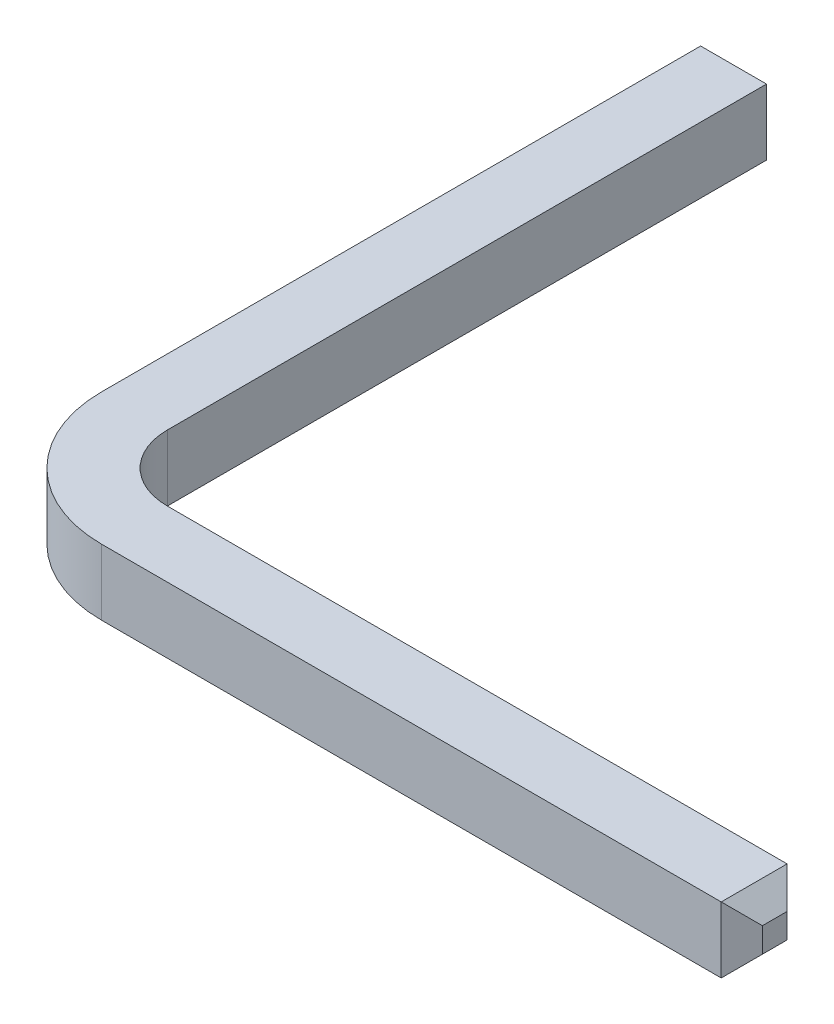
ISO-10303-21;
HEADER;
FILE_DESCRIPTION(('STEP AP214'),'2;1');
FILE_NAME('part.step','',(''),(''),'','','');
FILE_SCHEMA(('AUTOMOTIVE_DESIGN { 1 0 10303 214 1 1 1 1 }'));
ENDSEC;
DATA;
#1=APPLICATION_CONTEXT('core data for automotive mechanical design processes');
#2=APPLICATION_PROTOCOL_DEFINITION('international standard','automotive_design',2000,#1);
#3=PRODUCT_CONTEXT('',#1,'mechanical');
#4=PRODUCT('Part','Part','',(#3));
#5=PRODUCT_RELATED_PRODUCT_CATEGORY('part','',(#4));
#6=PRODUCT_DEFINITION_FORMATION('','',#4);
#7=PRODUCT_DEFINITION_CONTEXT('part definition',#1,'design');
#8=PRODUCT_DEFINITION('design','',#6,#7);
#9=PRODUCT_DEFINITION_SHAPE('','',#8);
#10=(LENGTH_UNIT() NAMED_UNIT(*) SI_UNIT(.MILLI.,.METRE.));
#11=(NAMED_UNIT(*) PLANE_ANGLE_UNIT() SI_UNIT($,.RADIAN.));
#12=(NAMED_UNIT(*) SI_UNIT($,.STERADIAN.) SOLID_ANGLE_UNIT());
#13=UNCERTAINTY_MEASURE_WITH_UNIT(LENGTH_MEASURE(1.E-05),#10,'distance_accuracy_value','');
#14=(GEOMETRIC_REPRESENTATION_CONTEXT(3) GLOBAL_UNCERTAINTY_ASSIGNED_CONTEXT((#13)) GLOBAL_UNIT_ASSIGNED_CONTEXT((#10,
#11,#12)) REPRESENTATION_CONTEXT('',''));
#15=CARTESIAN_POINT('',(0.,0.,0.));
#16=DIRECTION('',(0.,0.,1.));
#17=DIRECTION('',(1.,0.,0.));
#18=AXIS2_PLACEMENT_3D('',#15,#16,#17);
#19=CARTESIAN_POINT('',(7.08,-0.22,7.1));
#20=DIRECTION('',(-0.707106781186548,0.707106781186548,0.));
#21=DIRECTION('',(-0.707106781186548,-0.707106781186548,0.));
#22=AXIS2_PLACEMENT_3D('',#19,#20,#21);
#23=PLANE('',#22);
#24=DIRECTION('',(-0.577350269189625,-0.577350269189627,-0.577350269189625));
#25=VECTOR('',#24,1.);
#26=CARTESIAN_POINT('',(7.18,-0.12,6.86));
#27=LINE('',#26,#25);
#28=CARTESIAN_POINT('',(7.18,-0.12,6.86));
#29=VERTEX_POINT('',#28);
#30=CARTESIAN_POINT('',(6.98,-0.32,6.66));
#31=VERTEX_POINT('',#30);
#32=EDGE_CURVE('E203',#29,#31,#27,.T.);
#33=ORIENTED_EDGE('',*,*,#32,.F.);
#34=DIRECTION('',(0.,0.,-1.));
#35=VECTOR('',#34,1.);
#36=CARTESIAN_POINT('',(7.18,-0.12,7.3));
#37=LINE('',#36,#35);
#38=CARTESIAN_POINT('',(7.18,-0.12,7.1));
#39=VERTEX_POINT('',#38);
#40=EDGE_CURVE('E215',#39,#29,#37,.T.);
#41=ORIENTED_EDGE('',*,*,#40,.F.);
#42=DIRECTION('',(0.577350269189625,0.577350269189627,-0.577350269189625));
#43=VECTOR('',#42,1.);
#44=CARTESIAN_POINT('',(6.98,-0.32,7.3));
#45=LINE('',#44,#43);
#46=CARTESIAN_POINT('',(6.98,-0.32,7.3));
#47=VERTEX_POINT('',#46);
#48=EDGE_CURVE('E229',#47,#39,#45,.T.);
#49=ORIENTED_EDGE('',*,*,#48,.F.);
#50=DIRECTION('',(0.,0.,1.));
#51=VECTOR('',#50,1.);
#52=CARTESIAN_POINT('',(6.98,-0.32,5.1935));
#53=LINE('',#52,#51);
#54=EDGE_CURVE('E128',#47,#31,#53,.F.);
#55=ORIENTED_EDGE('',*,*,#54,.T.);
#56=EDGE_LOOP('',(#33,#41,#49,#55));
#57=FACE_BOUND('',#56,.T.);
#58=ADVANCED_FACE('F16',(#57),#23,.F.);
#59=CARTESIAN_POINT('',(0.12,-0.22,0.1));
#60=DIRECTION('',(0.,0.707106781186548,0.707106781186548));
#61=DIRECTION('',(0.,-0.707106781186548,0.707106781186548));
#62=AXIS2_PLACEMENT_3D('',#59,#60,#61);
#63=PLANE('',#62);
#64=DIRECTION('',(-0.577350269189626,-0.577350269189626,0.577350269189626));
#65=VECTOR('',#64,1.);
#66=CARTESIAN_POINT('',(-0.12,-0.12,0.));
#67=LINE('',#66,#65);
#68=CARTESIAN_POINT('',(-0.12,-0.12,0.));
#69=VERTEX_POINT('',#68);
#70=CARTESIAN_POINT('',(-0.32,-0.32,0.2));
#71=VERTEX_POINT('',#70);
#72=EDGE_CURVE('E164',#69,#71,#67,.T.);
#73=ORIENTED_EDGE('',*,*,#72,.F.);
#74=DIRECTION('',(1.,0.,0.));
#75=VECTOR('',#74,1.);
#76=CARTESIAN_POINT('',(0.32,-0.12,0.));
#77=LINE('',#76,#75);
#78=CARTESIAN_POINT('',(0.12,-0.12,0.));
#79=VERTEX_POINT('',#78);
#80=EDGE_CURVE('E174',#79,#69,#77,.F.);
#81=ORIENTED_EDGE('',*,*,#80,.F.);
#82=DIRECTION('',(-0.577350269189626,0.577350269189626,-0.577350269189626));
#83=VECTOR('',#82,1.);
#84=CARTESIAN_POINT('',(0.32,-0.32,0.2));
#85=LINE('',#84,#83);
#86=CARTESIAN_POINT('',(0.32,-0.32,0.2));
#87=VERTEX_POINT('',#86);
#88=EDGE_CURVE('E175',#87,#79,#85,.T.);
#89=ORIENTED_EDGE('',*,*,#88,.F.);
#90=DIRECTION('',(1.,0.,0.));
#91=VECTOR('',#90,1.);
#92=CARTESIAN_POINT('',(1.8865,-0.320000000000001,0.2));
#93=LINE('',#92,#91);
#94=EDGE_CURVE('E179',#87,#71,#93,.F.);
#95=ORIENTED_EDGE('',*,*,#94,.T.);
#96=EDGE_LOOP('',(#73,#81,#89,#95));
#97=FACE_BOUND('',#96,.T.);
#98=ADVANCED_FACE('F343',(#97),#63,.F.);
#99=CARTESIAN_POINT('',(7.08,0.32,7.2));
#100=DIRECTION('',(0.707106781186548,0.,0.707106781186548));
#101=DIRECTION('',(0.707106781186548,0.,-0.707106781186548));
#102=AXIS2_PLACEMENT_3D('',#99,#100,#101);
#103=PLANE('',#102);
#104=DIRECTION('',(0.,-1.,0.));
#105=VECTOR('',#104,1.);
#106=CARTESIAN_POINT('',(6.98,0.32,7.3));
#107=LINE('',#106,#105);
#108=CARTESIAN_POINT('',(6.98,0.32,7.3));
#109=VERTEX_POINT('',#108);
#110=EDGE_CURVE('E133',#47,#109,#107,.F.);
#111=ORIENTED_EDGE('',*,*,#110,.F.);
#112=ORIENTED_EDGE('',*,*,#48,.T.);
#113=DIRECTION('',(0.,1.,0.));
#114=VECTOR('',#113,1.);
#115=CARTESIAN_POINT('',(7.18,0.32,7.1));
#116=LINE('',#115,#114);
#117=CARTESIAN_POINT('',(7.18,0.12,7.1));
#118=VERTEX_POINT('',#117);
#119=EDGE_CURVE('E225',#118,#39,#116,.F.);
#120=ORIENTED_EDGE('',*,*,#119,.F.);
#121=DIRECTION('',(0.577350269189624,-0.577350269189625,-0.577350269189629));
#122=VECTOR('',#121,1.);
#123=CARTESIAN_POINT('',(6.98,0.32,7.3));
#124=LINE('',#123,#122);
#125=EDGE_CURVE('E146',#109,#118,#124,.T.);
#126=ORIENTED_EDGE('',*,*,#125,.F.);
#127=EDGE_LOOP('',(#111,#112,#120,#126));
#128=FACE_BOUND('',#127,.T.);
#129=ADVANCED_FACE('F294',(#128),#103,.T.);
#130=CARTESIAN_POINT('',(7.18,0.32,7.3));
#131=DIRECTION('',(1.,0.,0.));
#132=DIRECTION('',(0.,0.,-1.));
#133=AXIS2_PLACEMENT_3D('',#130,#131,#132);
#134=PLANE('',#133);
#135=ORIENTED_EDGE('',*,*,#119,.T.);
#136=ORIENTED_EDGE('',*,*,#40,.T.);
#137=DIRECTION('',(0.,1.,0.));
#138=VECTOR('',#137,1.);
#139=CARTESIAN_POINT('',(7.18,0.32,6.86));
#140=LINE('',#139,#138);
#141=CARTESIAN_POINT('',(7.18,0.12,6.86));
#142=VERTEX_POINT('',#141);
#143=EDGE_CURVE('E209',#142,#29,#140,.F.);
#144=ORIENTED_EDGE('',*,*,#143,.F.);
#145=DIRECTION('',(0.,0.,1.));
#146=VECTOR('',#145,1.);
#147=CARTESIAN_POINT('',(7.18,0.12,7.1));
#148=LINE('',#147,#146);
#149=EDGE_CURVE('E218',#118,#142,#148,.F.);
#150=ORIENTED_EDGE('',*,*,#149,.F.);
#151=EDGE_LOOP('',(#135,#136,#144,#150));
#152=FACE_BOUND('',#151,.T.);
#153=ADVANCED_FACE('F297',(#152),#134,.T.);
#154=CARTESIAN_POINT('',(7.08,0.32,6.76));
#155=DIRECTION('',(0.707106781186548,0.,-0.707106781186548));
#156=DIRECTION('',(-0.707106781186548,0.,-0.707106781186548));
#157=AXIS2_PLACEMENT_3D('',#154,#155,#156);
#158=PLANE('',#157);
#159=DIRECTION('',(0.,1.,0.));
#160=VECTOR('',#159,1.);
#161=CARTESIAN_POINT('',(6.98,0.32,6.66));
#162=LINE('',#161,#160);
#163=CARTESIAN_POINT('',(6.98,0.32,6.66));
#164=VERTEX_POINT('',#163);
#165=EDGE_CURVE('E198',#164,#31,#162,.F.);
#166=ORIENTED_EDGE('',*,*,#165,.F.);
#167=DIRECTION('',(-0.577350269189624,0.577350269189625,-0.577350269189629));
#168=VECTOR('',#167,1.);
#169=CARTESIAN_POINT('',(7.18,0.12,6.86));
#170=LINE('',#169,#168);
#171=EDGE_CURVE('E222',#142,#164,#170,.T.);
#172=ORIENTED_EDGE('',*,*,#171,.F.);
#173=ORIENTED_EDGE('',*,*,#143,.T.);
#174=ORIENTED_EDGE('',*,*,#32,.T.);
#175=EDGE_LOOP('',(#166,#172,#173,#174));
#176=FACE_BOUND('',#175,.T.);
#177=ADVANCED_FACE('F301',(#176),#158,.T.);
#178=CARTESIAN_POINT('',(1.8865,-0.32,5.1935));
#179=DIRECTION('',(0.,1.,0.));
#180=DIRECTION('',(0.,0.,1.));
#181=AXIS2_PLACEMENT_3D('',#178,#179,#180);
#182=PLANE('',#181);
#183=DIRECTION('',(0.,0.,-1.));
#184=VECTOR('',#183,1.);
#185=CARTESIAN_POINT('',(0.32,-0.32,6.66));
#186=LINE('',#185,#184);
#187=CARTESIAN_POINT('',(0.32,-0.32,6.02));
#188=VERTEX_POINT('',#187);
#189=EDGE_CURVE('E182',#188,#87,#186,.T.);
#190=ORIENTED_EDGE('',*,*,#189,.F.);
#191=CARTESIAN_POINT('',(0.96,-0.32,6.02));
#192=DIRECTION('',(0.,-1.,0.));
#193=DIRECTION('',(0.,0.,-1.));
#194=AXIS2_PLACEMENT_3D('',#191,#192,#193);
#195=CIRCLE('',#194,0.64);
#196=CARTESIAN_POINT('',(0.96,-0.32,6.66));
#197=VERTEX_POINT('',#196);
#198=EDGE_CURVE('E197',#188,#197,#195,.F.);
#199=ORIENTED_EDGE('',*,*,#198,.T.);
#200=DIRECTION('',(1.,0.,0.));
#201=VECTOR('',#200,1.);
#202=CARTESIAN_POINT('',(7.18,-0.32,6.66));
#203=LINE('',#202,#201);
#204=EDGE_CURVE('E193',#31,#197,#203,.F.);
#205=ORIENTED_EDGE('',*,*,#204,.F.);
#206=ORIENTED_EDGE('',*,*,#54,.F.);
#207=DIRECTION('',(1.,0.,0.));
#208=VECTOR('',#207,1.);
#209=CARTESIAN_POINT('',(-0.32,-0.32,7.3));
#210=LINE('',#209,#208);
#211=CARTESIAN_POINT('',(0.96,-0.32,7.3));
#212=VERTEX_POINT('',#211);
#213=EDGE_CURVE('E124',#212,#47,#210,.T.);
#214=ORIENTED_EDGE('',*,*,#213,.F.);
#215=CARTESIAN_POINT('',(0.96,-0.32,6.02));
#216=DIRECTION('',(0.,-1.,0.));
#217=DIRECTION('',(0.,0.,-1.));
#218=AXIS2_PLACEMENT_3D('',#215,#216,#217);
#219=CIRCLE('',#218,1.28);
#220=CARTESIAN_POINT('',(-0.32,-0.32,6.02));
#221=VERTEX_POINT('',#220);
#222=EDGE_CURVE('E19',#221,#212,#219,.F.);
#223=ORIENTED_EDGE('',*,*,#222,.F.);
#224=DIRECTION('',(0.,0.,1.));
#225=VECTOR('',#224,1.);
#226=CARTESIAN_POINT('',(-0.32,-0.32,0.));
#227=LINE('',#226,#225);
#228=EDGE_CURVE('E109',#71,#221,#227,.T.);
#229=ORIENTED_EDGE('',*,*,#228,.F.);
#230=ORIENTED_EDGE('',*,*,#94,.F.);
#231=EDGE_LOOP('',(#190,#199,#205,#206,#214,#223,#229,#230));
#232=FACE_BOUND('',#231,.T.);
#233=ADVANCED_FACE('F126',(#232),#182,.F.);
#234=CARTESIAN_POINT('',(0.22,0.32,0.1));
#235=DIRECTION('',(0.707106781186548,0.,-0.707106781186548));
#236=DIRECTION('',(-0.707106781186548,0.,-0.707106781186548));
#237=AXIS2_PLACEMENT_3D('',#234,#235,#236);
#238=PLANE('',#237);
#239=ORIENTED_EDGE('',*,*,#88,.T.);
#240=DIRECTION('',(0.,1.,0.));
#241=VECTOR('',#240,1.);
#242=CARTESIAN_POINT('',(0.12,0.32,0.));
#243=LINE('',#242,#241);
#244=CARTESIAN_POINT('',(0.12,0.12,0.));
#245=VERTEX_POINT('',#244);
#246=EDGE_CURVE('E171',#245,#79,#243,.F.);
#247=ORIENTED_EDGE('',*,*,#246,.F.);
#248=DIRECTION('',(-0.577350269189626,-0.577350269189626,-0.577350269189626));
#249=VECTOR('',#248,1.);
#250=CARTESIAN_POINT('',(0.32,0.32,0.2));
#251=LINE('',#250,#249);
#252=CARTESIAN_POINT('',(0.32,0.319999999999999,0.2));
#253=VERTEX_POINT('',#252);
#254=EDGE_CURVE('E34',#253,#245,#251,.T.);
#255=ORIENTED_EDGE('',*,*,#254,.F.);
#256=DIRECTION('',(0.,1.,0.));
#257=VECTOR('',#256,1.);
#258=CARTESIAN_POINT('',(0.32,0.32,0.2));
#259=LINE('',#258,#257);
#260=EDGE_CURVE('E186',#87,#253,#259,.T.);
#261=ORIENTED_EDGE('',*,*,#260,.F.);
#262=EDGE_LOOP('',(#239,#247,#255,#261));
#263=FACE_BOUND('',#262,.T.);
#264=ADVANCED_FACE('F339',(#263),#238,.T.);
#265=CARTESIAN_POINT('',(0.32,0.32,0.));
#266=DIRECTION('',(0.,0.,-1.));
#267=DIRECTION('',(0.,1.,0.));
#268=AXIS2_PLACEMENT_3D('',#265,#266,#267);
#269=PLANE('',#268);
#270=DIRECTION('',(0.,1.,0.));
#271=VECTOR('',#270,1.);
#272=CARTESIAN_POINT('',(-0.12,0.32,0.));
#273=LINE('',#272,#271);
#274=CARTESIAN_POINT('',(-0.12,0.12,0.));
#275=VERTEX_POINT('',#274);
#276=EDGE_CURVE('E152',#275,#69,#273,.F.);
#277=ORIENTED_EDGE('',*,*,#276,.F.);
#278=DIRECTION('',(1.,0.,0.));
#279=VECTOR('',#278,1.);
#280=CARTESIAN_POINT('',(0.12,0.12,0.));
#281=LINE('',#280,#279);
#282=EDGE_CURVE('E159',#245,#275,#281,.F.);
#283=ORIENTED_EDGE('',*,*,#282,.F.);
#284=ORIENTED_EDGE('',*,*,#246,.T.);
#285=ORIENTED_EDGE('',*,*,#80,.T.);
#286=EDGE_LOOP('',(#277,#283,#284,#285));
#287=FACE_BOUND('',#286,.T.);
#288=ADVANCED_FACE('F345',(#287),#269,.T.);
#289=CARTESIAN_POINT('',(-0.22,0.32,0.1));
#290=DIRECTION('',(-0.707106781186548,0.,-0.707106781186548));
#291=DIRECTION('',(-0.707106781186548,0.,0.707106781186548));
#292=AXIS2_PLACEMENT_3D('',#289,#290,#291);
#293=PLANE('',#292);
#294=DIRECTION('',(-0.577350269189626,0.577350269189626,0.577350269189626));
#295=VECTOR('',#294,1.);
#296=CARTESIAN_POINT('',(-0.12,0.12,0.));
#297=LINE('',#296,#295);
#298=CARTESIAN_POINT('',(-0.32,0.319999999999999,0.2));
#299=VERTEX_POINT('',#298);
#300=EDGE_CURVE('E155',#275,#299,#297,.T.);
#301=ORIENTED_EDGE('',*,*,#300,.F.);
#302=ORIENTED_EDGE('',*,*,#276,.T.);
#303=ORIENTED_EDGE('',*,*,#72,.T.);
#304=DIRECTION('',(0.,1.,0.));
#305=VECTOR('',#304,1.);
#306=CARTESIAN_POINT('',(-0.32,0.32,0.2));
#307=LINE('',#306,#305);
#308=EDGE_CURVE('E150',#299,#71,#307,.F.);
#309=ORIENTED_EDGE('',*,*,#308,.F.);
#310=EDGE_LOOP('',(#301,#302,#303,#309));
#311=FACE_BOUND('',#310,.T.);
#312=ADVANCED_FACE('F347',(#311),#293,.T.);
#313=CARTESIAN_POINT('',(-0.32,0.32,0.));
#314=DIRECTION('',(-1.,0.,0.));
#315=DIRECTION('',(0.,0.,1.));
#316=AXIS2_PLACEMENT_3D('',#313,#314,#315);
#317=PLANE('',#316);
#318=ORIENTED_EDGE('',*,*,#228,.T.);
#319=DIRECTION('',(0.,-1.,0.));
#320=VECTOR('',#319,1.);
#321=CARTESIAN_POINT('',(-0.32,0.32,6.02));
#322=LINE('',#321,#320);
#323=CARTESIAN_POINT('',(-0.32,0.32,6.02));
#324=VERTEX_POINT('',#323);
#325=EDGE_CURVE('E120',#324,#221,#322,.T.);
#326=ORIENTED_EDGE('',*,*,#325,.F.);
#327=DIRECTION('',(0.,0.,1.));
#328=VECTOR('',#327,1.);
#329=CARTESIAN_POINT('',(-0.32,0.32,5.1935));
#330=LINE('',#329,#328);
#331=EDGE_CURVE('E158',#299,#324,#330,.T.);
#332=ORIENTED_EDGE('',*,*,#331,.F.);
#333=ORIENTED_EDGE('',*,*,#308,.T.);
#334=EDGE_LOOP('',(#318,#326,#332,#333));
#335=FACE_BOUND('',#334,.T.);
#336=ADVANCED_FACE('F349',(#335),#317,.T.);
#337=CARTESIAN_POINT('',(0.96,0.32,6.02));
#338=DIRECTION('',(0.,-1.,0.));
#339=DIRECTION('',(0.,0.,-1.));
#340=AXIS2_PLACEMENT_3D('',#337,#338,#339);
#341=CYLINDRICAL_SURFACE('',#340,1.28);
#342=DIRECTION('',(0.,-1.,0.));
#343=VECTOR('',#342,1.);
#344=CARTESIAN_POINT('',(0.96,0.32,7.3));
#345=LINE('',#344,#343);
#346=CARTESIAN_POINT('',(0.96,0.32,7.3));
#347=VERTEX_POINT('',#346);
#348=EDGE_CURVE('E118',#347,#212,#345,.T.);
#349=ORIENTED_EDGE('',*,*,#348,.F.);
#350=CARTESIAN_POINT('',(0.96,0.32,6.02));
#351=DIRECTION('',(0.,-1.,0.));
#352=DIRECTION('',(0.,0.,-1.));
#353=AXIS2_PLACEMENT_3D('',#350,#351,#352);
#354=CIRCLE('',#353,1.28);
#355=EDGE_CURVE('E258',#324,#347,#354,.F.);
#356=ORIENTED_EDGE('',*,*,#355,.F.);
#357=ORIENTED_EDGE('',*,*,#325,.T.);
#358=ORIENTED_EDGE('',*,*,#222,.T.);
#359=EDGE_LOOP('',(#349,#356,#357,#358));
#360=FACE_BOUND('',#359,.T.);
#361=ADVANCED_FACE('F115',(#360),#341,.T.);
#362=CARTESIAN_POINT('',(-0.32,0.32,7.3));
#363=DIRECTION('',(0.,0.,1.));
#364=DIRECTION('',(0.,-1.,0.));
#365=AXIS2_PLACEMENT_3D('',#362,#363,#364);
#366=PLANE('',#365);
#367=ORIENTED_EDGE('',*,*,#213,.T.);
#368=ORIENTED_EDGE('',*,*,#110,.T.);
#369=DIRECTION('',(1.,0.,0.));
#370=VECTOR('',#369,1.);
#371=CARTESIAN_POINT('',(1.8865,0.320000000000001,7.3));
#372=LINE('',#371,#370);
#373=EDGE_CURVE('E137',#347,#109,#372,.T.);
#374=ORIENTED_EDGE('',*,*,#373,.F.);
#375=ORIENTED_EDGE('',*,*,#348,.T.);
#376=EDGE_LOOP('',(#367,#368,#374,#375));
#377=FACE_BOUND('',#376,.T.);
#378=ADVANCED_FACE('F135',(#377),#366,.T.);
#379=CARTESIAN_POINT('',(7.08,0.22,7.1));
#380=DIRECTION('',(0.707106781186548,0.707106781186548,0.));
#381=DIRECTION('',(-0.707106781186548,0.707106781186548,0.));
#382=AXIS2_PLACEMENT_3D('',#379,#380,#381);
#383=PLANE('',#382);
#384=ORIENTED_EDGE('',*,*,#171,.T.);
#385=DIRECTION('',(0.,0.,1.));
#386=VECTOR('',#385,1.);
#387=CARTESIAN_POINT('',(6.98,0.32,5.1935));
#388=LINE('',#387,#386);
#389=EDGE_CURVE('E276',#109,#164,#388,.F.);
#390=ORIENTED_EDGE('',*,*,#389,.F.);
#391=ORIENTED_EDGE('',*,*,#125,.T.);
#392=ORIENTED_EDGE('',*,*,#149,.T.);
#393=EDGE_LOOP('',(#384,#390,#391,#392));
#394=FACE_BOUND('',#393,.T.);
#395=ADVANCED_FACE('F291',(#394),#383,.T.);
#396=CARTESIAN_POINT('',(7.18,0.32,6.66));
#397=DIRECTION('',(0.,0.,-1.));
#398=DIRECTION('',(0.,1.,0.));
#399=AXIS2_PLACEMENT_3D('',#396,#397,#398);
#400=PLANE('',#399);
#401=ORIENTED_EDGE('',*,*,#204,.T.);
#402=DIRECTION('',(0.,-1.,0.));
#403=VECTOR('',#402,1.);
#404=CARTESIAN_POINT('',(0.96,0.32,6.66));
#405=LINE('',#404,#403);
#406=CARTESIAN_POINT('',(0.96,0.32,6.66));
#407=VERTEX_POINT('',#406);
#408=EDGE_CURVE('E259',#197,#407,#405,.F.);
#409=ORIENTED_EDGE('',*,*,#408,.T.);
#410=DIRECTION('',(1.,0.,0.));
#411=VECTOR('',#410,1.);
#412=CARTESIAN_POINT('',(1.8865,0.32,6.66));
#413=LINE('',#412,#411);
#414=EDGE_CURVE('E257',#164,#407,#413,.F.);
#415=ORIENTED_EDGE('',*,*,#414,.F.);
#416=ORIENTED_EDGE('',*,*,#165,.T.);
#417=EDGE_LOOP('',(#401,#409,#415,#416));
#418=FACE_BOUND('',#417,.T.);
#419=ADVANCED_FACE('F303',(#418),#400,.T.);
#420=CARTESIAN_POINT('',(0.96,0.32,6.02));
#421=DIRECTION('',(0.,-1.,0.));
#422=DIRECTION('',(0.,0.,-1.));
#423=AXIS2_PLACEMENT_3D('',#420,#421,#422);
#424=CYLINDRICAL_SURFACE('',#423,0.64);
#425=ORIENTED_EDGE('',*,*,#408,.F.);
#426=ORIENTED_EDGE('',*,*,#198,.F.);
#427=DIRECTION('',(0.,1.,0.));
#428=VECTOR('',#427,1.);
#429=CARTESIAN_POINT('',(0.32,0.32,6.02));
#430=LINE('',#429,#428);
#431=CARTESIAN_POINT('',(0.32,0.32,6.02));
#432=VERTEX_POINT('',#431);
#433=EDGE_CURVE('E187',#432,#188,#430,.F.);
#434=ORIENTED_EDGE('',*,*,#433,.F.);
#435=CARTESIAN_POINT('',(0.96,0.32,6.02));
#436=DIRECTION('',(0.,-1.,0.));
#437=DIRECTION('',(0.,0.,-1.));
#438=AXIS2_PLACEMENT_3D('',#435,#436,#437);
#439=CIRCLE('',#438,0.64);
#440=EDGE_CURVE('E254',#407,#432,#439,.T.);
#441=ORIENTED_EDGE('',*,*,#440,.F.);
#442=EDGE_LOOP('',(#425,#426,#434,#441));
#443=FACE_BOUND('',#442,.T.);
#444=ADVANCED_FACE('F368',(#443),#424,.F.);
#445=CARTESIAN_POINT('',(0.32,0.32,6.66));
#446=DIRECTION('',(1.,0.,0.));
#447=DIRECTION('',(0.,0.,-1.));
#448=AXIS2_PLACEMENT_3D('',#445,#446,#447);
#449=PLANE('',#448);
#450=ORIENTED_EDGE('',*,*,#189,.T.);
#451=ORIENTED_EDGE('',*,*,#260,.T.);
#452=DIRECTION('',(0.,0.,1.));
#453=VECTOR('',#452,1.);
#454=CARTESIAN_POINT('',(0.32,0.32,5.1935));
#455=LINE('',#454,#453);
#456=EDGE_CURVE('E25',#432,#253,#455,.F.);
#457=ORIENTED_EDGE('',*,*,#456,.F.);
#458=ORIENTED_EDGE('',*,*,#433,.T.);
#459=EDGE_LOOP('',(#450,#451,#457,#458));
#460=FACE_BOUND('',#459,.T.);
#461=ADVANCED_FACE('F338',(#460),#449,.T.);
#462=CARTESIAN_POINT('',(0.12,0.22,0.1));
#463=DIRECTION('',(0.,0.707106781186548,-0.707106781186548));
#464=DIRECTION('',(0.,0.707106781186548,0.707106781186548));
#465=AXIS2_PLACEMENT_3D('',#462,#463,#464);
#466=PLANE('',#465);
#467=ORIENTED_EDGE('',*,*,#300,.T.);
#468=DIRECTION('',(1.,0.,0.));
#469=VECTOR('',#468,1.);
#470=CARTESIAN_POINT('',(1.8865,0.319999999999999,0.2));
#471=LINE('',#470,#469);
#472=EDGE_CURVE('E11',#253,#299,#471,.F.);
#473=ORIENTED_EDGE('',*,*,#472,.F.);
#474=ORIENTED_EDGE('',*,*,#254,.T.);
#475=ORIENTED_EDGE('',*,*,#282,.T.);
#476=EDGE_LOOP('',(#467,#473,#474,#475));
#477=FACE_BOUND('',#476,.T.);
#478=ADVANCED_FACE('F327',(#477),#466,.T.);
#479=CARTESIAN_POINT('',(1.8865,0.32,5.1935));
#480=DIRECTION('',(0.,1.,0.));
#481=DIRECTION('',(0.,0.,1.));
#482=AXIS2_PLACEMENT_3D('',#479,#480,#481);
#483=PLANE('',#482);
#484=ORIENTED_EDGE('',*,*,#456,.T.);
#485=ORIENTED_EDGE('',*,*,#472,.T.);
#486=ORIENTED_EDGE('',*,*,#331,.T.);
#487=ORIENTED_EDGE('',*,*,#355,.T.);
#488=ORIENTED_EDGE('',*,*,#373,.T.);
#489=ORIENTED_EDGE('',*,*,#389,.T.);
#490=ORIENTED_EDGE('',*,*,#414,.T.);
#491=ORIENTED_EDGE('',*,*,#440,.T.);
#492=EDGE_LOOP('',(#484,#485,#486,#487,#488,#489,#490,#491));
#493=FACE_BOUND('',#492,.T.);
#494=ADVANCED_FACE('F308',(#493),#483,.T.);
#495=CLOSED_SHELL('',(#58,#98,#129,#153,#177,#233,#264,#288,#312,#336,#361,#378,#395,#419,#444,
#461,#478,#494));
#496=MANIFOLD_SOLID_BREP('B1',#495);
#497=ADVANCED_BREP_SHAPE_REPRESENTATION('',(#18,#496),#14);
#498=SHAPE_DEFINITION_REPRESENTATION(#9,#497);
ENDSEC;
END-ISO-10303-21;
